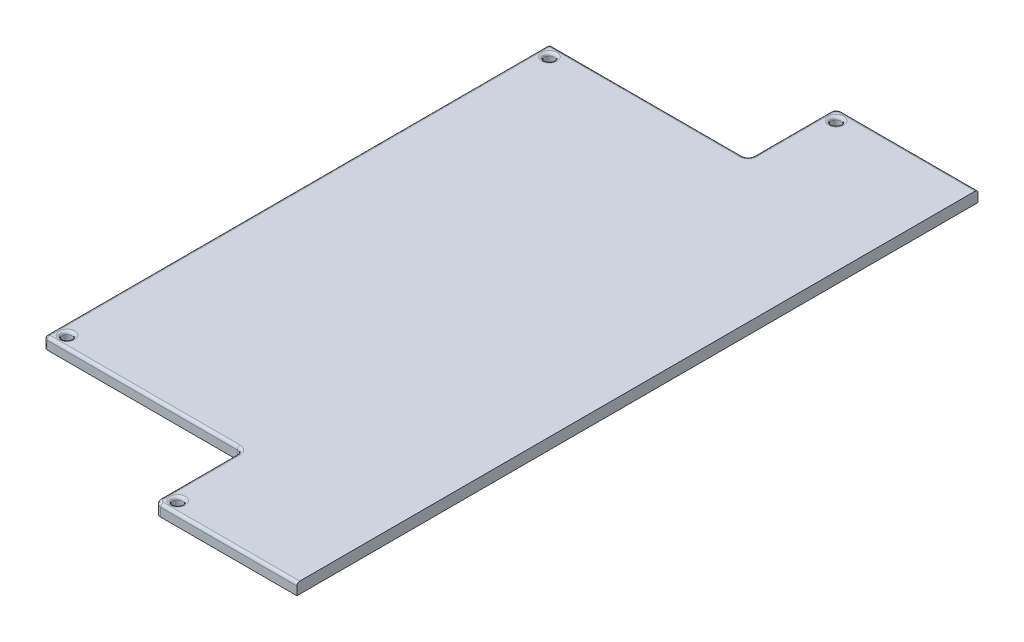
ISO-10303-21;
HEADER;
FILE_DESCRIPTION(('STEP AP214'),'2;1');
FILE_NAME('part.step','',(''),(''),'','','');
FILE_SCHEMA(('AUTOMOTIVE_DESIGN { 1 0 10303 214 1 1 1 1 }'));
ENDSEC;
DATA;
#1=APPLICATION_CONTEXT('core data for automotive mechanical design processes');
#2=APPLICATION_PROTOCOL_DEFINITION('international standard','automotive_design',2000,#1);
#3=PRODUCT_CONTEXT('',#1,'mechanical');
#4=PRODUCT('Part','Part','',(#3));
#5=PRODUCT_RELATED_PRODUCT_CATEGORY('part','',(#4));
#6=PRODUCT_DEFINITION_FORMATION('','',#4);
#7=PRODUCT_DEFINITION_CONTEXT('part definition',#1,'design');
#8=PRODUCT_DEFINITION('design','',#6,#7);
#9=PRODUCT_DEFINITION_SHAPE('','',#8);
#10=(LENGTH_UNIT() NAMED_UNIT(*) SI_UNIT(.MILLI.,.METRE.));
#11=(NAMED_UNIT(*) PLANE_ANGLE_UNIT() SI_UNIT($,.RADIAN.));
#12=(NAMED_UNIT(*) SI_UNIT($,.STERADIAN.) SOLID_ANGLE_UNIT());
#13=UNCERTAINTY_MEASURE_WITH_UNIT(LENGTH_MEASURE(1.E-05),#10,'distance_accuracy_value','');
#14=(GEOMETRIC_REPRESENTATION_CONTEXT(3) GLOBAL_UNCERTAINTY_ASSIGNED_CONTEXT((#13)) GLOBAL_UNIT_ASSIGNED_CONTEXT((#10,
#11,#12)) REPRESENTATION_CONTEXT('',''));
#15=CARTESIAN_POINT('',(0.,0.,0.));
#16=DIRECTION('',(0.,0.,1.));
#17=DIRECTION('',(1.,0.,0.));
#18=AXIS2_PLACEMENT_3D('',#15,#16,#17);
#19=CARTESIAN_POINT('',(0.,3.99999999999999,0.));
#20=DIRECTION('',(0.,-1.,0.));
#21=DIRECTION('',(0.,0.,-1.));
#22=AXIS2_PLACEMENT_3D('',#19,#20,#21);
#23=PLANE('',#22);
#24=CARTESIAN_POINT('',(-46.,3.99999999999999,116.));
#25=DIRECTION('',(0.,-1.,0.));
#26=DIRECTION('',(0.,0.,-1.));
#27=AXIS2_PLACEMENT_3D('',#24,#25,#26);
#28=CIRCLE('',#27,2.7);
#29=CARTESIAN_POINT('',(-46.,3.99999999999999,113.3));
#30=VERTEX_POINT('',#29);
#31=EDGE_CURVE('E286',#30,#30,#28,.T.);
#32=ORIENTED_EDGE('',*,*,#31,.T.);
#33=EDGE_LOOP('',(#32));
#34=FACE_BOUND('',#33,.T.);
#35=CARTESIAN_POINT('',(-116.,3.99999999999999,85.));
#36=DIRECTION('',(0.,-1.,0.));
#37=DIRECTION('',(0.,0.,-1.));
#38=AXIS2_PLACEMENT_3D('',#35,#36,#37);
#39=CIRCLE('',#38,2.7);
#40=CARTESIAN_POINT('',(-116.,3.99999999999999,82.3));
#41=VERTEX_POINT('',#40);
#42=EDGE_CURVE('E283',#41,#41,#39,.T.);
#43=ORIENTED_EDGE('',*,*,#42,.T.);
#44=EDGE_LOOP('',(#43));
#45=FACE_BOUND('',#44,.T.);
#46=CARTESIAN_POINT('',(-116.,3.99999999999999,-85.));
#47=DIRECTION('',(0.,-1.,0.));
#48=DIRECTION('',(0.,0.,-1.));
#49=AXIS2_PLACEMENT_3D('',#46,#47,#48);
#50=CIRCLE('',#49,2.7);
#51=CARTESIAN_POINT('',(-116.,3.99999999999999,-87.7));
#52=VERTEX_POINT('',#51);
#53=EDGE_CURVE('E280',#52,#52,#50,.T.);
#54=ORIENTED_EDGE('',*,*,#53,.T.);
#55=EDGE_LOOP('',(#54));
#56=FACE_BOUND('',#55,.T.);
#57=CARTESIAN_POINT('',(-46.,3.99999999999999,-116.));
#58=DIRECTION('',(0.,-1.,0.));
#59=DIRECTION('',(0.,0.,-1.));
#60=AXIS2_PLACEMENT_3D('',#57,#58,#59);
#61=CIRCLE('',#60,2.7);
#62=CARTESIAN_POINT('',(-46.,3.99999999999999,-118.7));
#63=VERTEX_POINT('',#62);
#64=EDGE_CURVE('E277',#63,#63,#61,.T.);
#65=ORIENTED_EDGE('',*,*,#64,.T.);
#66=EDGE_LOOP('',(#65));
#67=FACE_BOUND('',#66,.T.);
#68=CARTESIAN_POINT('',(-48.,3.99999999999999,118.));
#69=DIRECTION('',(0.,-1.,0.));
#70=DIRECTION('',(0.,0.,-1.));
#71=AXIS2_PLACEMENT_3D('',#68,#69,#70);
#72=CIRCLE('',#71,1.);
#73=CARTESIAN_POINT('',(-49.,3.99999999999999,118.));
#74=VERTEX_POINT('',#73);
#75=CARTESIAN_POINT('',(-48.,3.99999999999999,119.));
#76=VERTEX_POINT('',#75);
#77=EDGE_CURVE('E272',#74,#76,#72,.F.);
#78=ORIENTED_EDGE('',*,*,#77,.T.);
#79=DIRECTION('',(1.,0.,0.));
#80=VECTOR('',#79,1.);
#81=CARTESIAN_POINT('',(0.,3.99999999999999,119.));
#82=LINE('',#81,#80);
#83=CARTESIAN_POINT('',(0.,3.99999999999999,119.));
#84=VERTEX_POINT('',#83);
#85=EDGE_CURVE('E274',#76,#84,#82,.T.);
#86=ORIENTED_EDGE('',*,*,#85,.T.);
#87=DIRECTION('',(0.,0.,-1.));
#88=VECTOR('',#87,1.);
#89=CARTESIAN_POINT('',(0.,3.99999999999999,0.));
#90=LINE('',#89,#88);
#91=CARTESIAN_POINT('',(0.,3.99999999999999,-119.));
#92=VERTEX_POINT('',#91);
#93=EDGE_CURVE('E226',#84,#92,#90,.T.);
#94=ORIENTED_EDGE('',*,*,#93,.T.);
#95=DIRECTION('',(-1.,0.,0.));
#96=VECTOR('',#95,1.);
#97=CARTESIAN_POINT('',(0.,3.99999999999999,-119.));
#98=LINE('',#97,#96);
#99=CARTESIAN_POINT('',(-48.,3.99999999999999,-119.));
#100=VERTEX_POINT('',#99);
#101=EDGE_CURVE('E266',#92,#100,#98,.T.);
#102=ORIENTED_EDGE('',*,*,#101,.T.);
#103=CARTESIAN_POINT('',(-48.,3.99999999999999,-118.));
#104=DIRECTION('',(0.,-1.,0.));
#105=DIRECTION('',(0.,0.,-1.));
#106=AXIS2_PLACEMENT_3D('',#103,#104,#105);
#107=CIRCLE('',#106,1.);
#108=CARTESIAN_POINT('',(-49.,3.99999999999999,-118.));
#109=VERTEX_POINT('',#108);
#110=EDGE_CURVE('E264',#100,#109,#107,.F.);
#111=ORIENTED_EDGE('',*,*,#110,.T.);
#112=DIRECTION('',(0.,0.,1.));
#113=VECTOR('',#112,1.);
#114=CARTESIAN_POINT('',(-49.,3.99999999999999,0.));
#115=LINE('',#114,#113);
#116=CARTESIAN_POINT('',(-49.,3.99999999999999,-91.));
#117=VERTEX_POINT('',#116);
#118=EDGE_CURVE('E262',#109,#117,#115,.T.);
#119=ORIENTED_EDGE('',*,*,#118,.T.);
#120=CARTESIAN_POINT('',(-52.,3.99999999999999,-91.));
#121=DIRECTION('',(0.,-1.,0.));
#122=DIRECTION('',(0.,0.,-1.));
#123=AXIS2_PLACEMENT_3D('',#120,#121,#122);
#124=CIRCLE('',#123,3.);
#125=CARTESIAN_POINT('',(-52.,3.99999999999999,-88.));
#126=VERTEX_POINT('',#125);
#127=EDGE_CURVE('E260',#117,#126,#124,.T.);
#128=ORIENTED_EDGE('',*,*,#127,.T.);
#129=DIRECTION('',(-1.,0.,0.));
#130=VECTOR('',#129,1.);
#131=CARTESIAN_POINT('',(0.,3.99999999999999,-88.));
#132=LINE('',#131,#130);
#133=CARTESIAN_POINT('',(-119.,3.99999999999999,-88.));
#134=VERTEX_POINT('',#133);
#135=EDGE_CURVE('E256',#126,#134,#132,.T.);
#136=ORIENTED_EDGE('',*,*,#135,.T.);
#137=DIRECTION('',(0.,0.,1.));
#138=VECTOR('',#137,1.);
#139=CARTESIAN_POINT('',(-119.,3.99999999999999,0.));
#140=LINE('',#139,#138);
#141=CARTESIAN_POINT('',(-119.,3.99999999999999,88.));
#142=VERTEX_POINT('',#141);
#143=EDGE_CURVE('E254',#134,#142,#140,.T.);
#144=ORIENTED_EDGE('',*,*,#143,.T.);
#145=DIRECTION('',(1.,0.,0.));
#146=VECTOR('',#145,1.);
#147=CARTESIAN_POINT('',(0.,3.99999999999999,88.));
#148=LINE('',#147,#146);
#149=CARTESIAN_POINT('',(-52.,3.99999999999999,88.));
#150=VERTEX_POINT('',#149);
#151=EDGE_CURVE('E258',#142,#150,#148,.T.);
#152=ORIENTED_EDGE('',*,*,#151,.T.);
#153=CARTESIAN_POINT('',(-52.,3.99999999999999,91.));
#154=DIRECTION('',(0.,-1.,0.));
#155=DIRECTION('',(0.,0.,-1.));
#156=AXIS2_PLACEMENT_3D('',#153,#154,#155);
#157=CIRCLE('',#156,3.);
#158=CARTESIAN_POINT('',(-49.,3.99999999999999,91.));
#159=VERTEX_POINT('',#158);
#160=EDGE_CURVE('E268',#150,#159,#157,.T.);
#161=ORIENTED_EDGE('',*,*,#160,.T.);
#162=DIRECTION('',(0.,0.,1.));
#163=VECTOR('',#162,1.);
#164=CARTESIAN_POINT('',(-49.,3.99999999999999,0.));
#165=LINE('',#164,#163);
#166=EDGE_CURVE('E270',#159,#74,#165,.T.);
#167=ORIENTED_EDGE('',*,*,#166,.T.);
#168=EDGE_LOOP('',(#78,#86,#94,#102,#111,#119,#128,#136,#144,#152,#161,#167));
#169=FACE_BOUND('',#168,.T.);
#170=ADVANCED_FACE('F41',(#34,#45,#56,#67,#169),#23,.F.);
#171=CARTESIAN_POINT('',(0.,0.,0.));
#172=DIRECTION('',(0.,-1.,0.));
#173=DIRECTION('',(0.,0.,-1.));
#174=AXIS2_PLACEMENT_3D('',#171,#172,#173);
#175=PLANE('',#174);
#176=CARTESIAN_POINT('',(-116.,0.,-85.));
#177=DIRECTION('',(0.,1.,0.));
#178=DIRECTION('',(0.,0.,1.));
#179=AXIS2_PLACEMENT_3D('',#176,#177,#178);
#180=CIRCLE('',#179,1.7);
#181=CARTESIAN_POINT('',(-116.,0.,-83.3));
#182=VERTEX_POINT('',#181);
#183=EDGE_CURVE('E381',#182,#182,#180,.T.);
#184=ORIENTED_EDGE('',*,*,#183,.T.);
#185=EDGE_LOOP('',(#184));
#186=FACE_BOUND('',#185,.T.);
#187=CARTESIAN_POINT('',(-46.,0.,116.));
#188=DIRECTION('',(0.,1.,0.));
#189=DIRECTION('',(0.,0.,1.));
#190=AXIS2_PLACEMENT_3D('',#187,#188,#189);
#191=CIRCLE('',#190,1.7);
#192=CARTESIAN_POINT('',(-46.,0.,117.7));
#193=VERTEX_POINT('',#192);
#194=EDGE_CURVE('E200',#193,#193,#191,.T.);
#195=ORIENTED_EDGE('',*,*,#194,.T.);
#196=EDGE_LOOP('',(#195));
#197=FACE_BOUND('',#196,.T.);
#198=DIRECTION('',(1.,0.,0.));
#199=VECTOR('',#198,1.);
#200=CARTESIAN_POINT('',(-50.,0.,89.));
#201=LINE('',#200,#199);
#202=CARTESIAN_POINT('',(-119.,0.,89.));
#203=VERTEX_POINT('',#202);
#204=CARTESIAN_POINT('',(-52.,0.,89.));
#205=VERTEX_POINT('',#204);
#206=EDGE_CURVE('E219',#203,#205,#201,.T.);
#207=ORIENTED_EDGE('',*,*,#206,.F.);
#208=CARTESIAN_POINT('',(-119.,0.,88.));
#209=DIRECTION('',(0.,-1.,0.));
#210=DIRECTION('',(0.,0.,-1.));
#211=AXIS2_PLACEMENT_3D('',#208,#209,#210);
#212=CIRCLE('',#211,1.);
#213=CARTESIAN_POINT('',(-120.,0.,88.));
#214=VERTEX_POINT('',#213);
#215=EDGE_CURVE('E11',#203,#214,#212,.T.);
#216=ORIENTED_EDGE('',*,*,#215,.T.);
#217=DIRECTION('',(0.,0.,1.));
#218=VECTOR('',#217,1.);
#219=CARTESIAN_POINT('',(-120.,0.,89.));
#220=LINE('',#219,#218);
#221=CARTESIAN_POINT('',(-120.,0.,-88.));
#222=VERTEX_POINT('',#221);
#223=EDGE_CURVE('E217',#222,#214,#220,.T.);
#224=ORIENTED_EDGE('',*,*,#223,.F.);
#225=CARTESIAN_POINT('',(-119.,0.,-88.));
#226=DIRECTION('',(0.,-1.,0.));
#227=DIRECTION('',(0.,0.,-1.));
#228=AXIS2_PLACEMENT_3D('',#225,#226,#227);
#229=CIRCLE('',#228,1.);
#230=CARTESIAN_POINT('',(-119.,0.,-89.));
#231=VERTEX_POINT('',#230);
#232=EDGE_CURVE('E50',#222,#231,#229,.T.);
#233=ORIENTED_EDGE('',*,*,#232,.T.);
#234=DIRECTION('',(-1.,0.,0.));
#235=VECTOR('',#234,1.);
#236=CARTESIAN_POINT('',(-50.,0.,-89.));
#237=LINE('',#236,#235);
#238=CARTESIAN_POINT('',(-52.,0.,-89.));
#239=VERTEX_POINT('',#238);
#240=EDGE_CURVE('E211',#239,#231,#237,.T.);
#241=ORIENTED_EDGE('',*,*,#240,.F.);
#242=CARTESIAN_POINT('',(-52.,0.,-91.));
#243=DIRECTION('',(0.,-1.,0.));
#244=DIRECTION('',(0.,0.,-1.));
#245=AXIS2_PLACEMENT_3D('',#242,#243,#244);
#246=CIRCLE('',#245,2.);
#247=CARTESIAN_POINT('',(-50.,0.,-91.));
#248=VERTEX_POINT('',#247);
#249=EDGE_CURVE('E249',#239,#248,#246,.F.);
#250=ORIENTED_EDGE('',*,*,#249,.T.);
#251=DIRECTION('',(0.,0.,1.));
#252=VECTOR('',#251,1.);
#253=CARTESIAN_POINT('',(-50.,0.,-120.));
#254=LINE('',#253,#252);
#255=CARTESIAN_POINT('',(-50.,0.,-118.));
#256=VERTEX_POINT('',#255);
#257=EDGE_CURVE('E208',#256,#248,#254,.T.);
#258=ORIENTED_EDGE('',*,*,#257,.F.);
#259=CARTESIAN_POINT('',(-48.,0.,-118.));
#260=DIRECTION('',(0.,-1.,0.));
#261=DIRECTION('',(0.,0.,-1.));
#262=AXIS2_PLACEMENT_3D('',#259,#260,#261);
#263=CIRCLE('',#262,2.);
#264=CARTESIAN_POINT('',(-48.,0.,-120.));
#265=VERTEX_POINT('',#264);
#266=EDGE_CURVE('E207',#256,#265,#263,.T.);
#267=ORIENTED_EDGE('',*,*,#266,.T.);
#268=DIRECTION('',(-1.,0.,0.));
#269=VECTOR('',#268,1.);
#270=CARTESIAN_POINT('',(-50.,0.,-120.));
#271=LINE('',#270,#269);
#272=CARTESIAN_POINT('',(0.,0.,-120.));
#273=VERTEX_POINT('',#272);
#274=EDGE_CURVE('E183',#273,#265,#271,.T.);
#275=ORIENTED_EDGE('',*,*,#274,.F.);
#276=DIRECTION('',(0.,0.,-1.));
#277=VECTOR('',#276,1.);
#278=CARTESIAN_POINT('',(0.,0.,0.));
#279=LINE('',#278,#277);
#280=CARTESIAN_POINT('',(0.,0.,120.));
#281=VERTEX_POINT('',#280);
#282=EDGE_CURVE('E193',#281,#273,#279,.T.);
#283=ORIENTED_EDGE('',*,*,#282,.F.);
#284=DIRECTION('',(1.,0.,0.));
#285=VECTOR('',#284,1.);
#286=CARTESIAN_POINT('',(0.,0.,120.));
#287=LINE('',#286,#285);
#288=CARTESIAN_POINT('',(-48.,0.,120.));
#289=VERTEX_POINT('',#288);
#290=EDGE_CURVE('E224',#289,#281,#287,.T.);
#291=ORIENTED_EDGE('',*,*,#290,.F.);
#292=CARTESIAN_POINT('',(-48.,0.,118.));
#293=DIRECTION('',(0.,-1.,0.));
#294=DIRECTION('',(0.,0.,-1.));
#295=AXIS2_PLACEMENT_3D('',#292,#293,#294);
#296=CIRCLE('',#295,2.);
#297=CARTESIAN_POINT('',(-50.,0.,118.));
#298=VERTEX_POINT('',#297);
#299=EDGE_CURVE('E234',#289,#298,#296,.T.);
#300=ORIENTED_EDGE('',*,*,#299,.T.);
#301=DIRECTION('',(0.,0.,1.));
#302=VECTOR('',#301,1.);
#303=CARTESIAN_POINT('',(-50.,0.,120.));
#304=LINE('',#303,#302);
#305=CARTESIAN_POINT('',(-50.,0.,91.));
#306=VERTEX_POINT('',#305);
#307=EDGE_CURVE('E221',#306,#298,#304,.T.);
#308=ORIENTED_EDGE('',*,*,#307,.F.);
#309=CARTESIAN_POINT('',(-52.,0.,91.));
#310=DIRECTION('',(0.,-1.,0.));
#311=DIRECTION('',(0.,0.,-1.));
#312=AXIS2_PLACEMENT_3D('',#309,#310,#311);
#313=CIRCLE('',#312,2.);
#314=EDGE_CURVE('E251',#306,#205,#313,.F.);
#315=ORIENTED_EDGE('',*,*,#314,.T.);
#316=EDGE_LOOP('',(#207,#216,#224,#233,#241,#250,#258,#267,#275,#283,#291,#300,#308,#315));
#317=FACE_BOUND('',#316,.T.);
#318=CARTESIAN_POINT('',(-116.,0.,85.));
#319=DIRECTION('',(0.,1.,0.));
#320=DIRECTION('',(0.,0.,1.));
#321=AXIS2_PLACEMENT_3D('',#318,#319,#320);
#322=CIRCLE('',#321,1.7);
#323=CARTESIAN_POINT('',(-116.,0.,86.7));
#324=VERTEX_POINT('',#323);
#325=EDGE_CURVE('E386',#324,#324,#322,.T.);
#326=ORIENTED_EDGE('',*,*,#325,.T.);
#327=EDGE_LOOP('',(#326));
#328=FACE_BOUND('',#327,.T.);
#329=CARTESIAN_POINT('',(-46.,0.,-116.));
#330=DIRECTION('',(0.,1.,0.));
#331=DIRECTION('',(0.,0.,1.));
#332=AXIS2_PLACEMENT_3D('',#329,#330,#331);
#333=CIRCLE('',#332,1.7);
#334=CARTESIAN_POINT('',(-46.,0.,-114.3));
#335=VERTEX_POINT('',#334);
#336=EDGE_CURVE('E375',#335,#335,#333,.T.);
#337=ORIENTED_EDGE('',*,*,#336,.T.);
#338=EDGE_LOOP('',(#337));
#339=FACE_BOUND('',#338,.T.);
#340=ADVANCED_FACE('F203',(#186,#197,#317,#328,#339),#175,.T.);
#341=CARTESIAN_POINT('',(0.,3.99999999999999,0.));
#342=DIRECTION('',(-1.,0.,0.));
#343=DIRECTION('',(0.,0.,1.));
#344=AXIS2_PLACEMENT_3D('',#341,#342,#343);
#345=PLANE('',#344);
#346=ORIENTED_EDGE('',*,*,#93,.F.);
#347=CARTESIAN_POINT('',(0.,2.99999999999999,119.));
#348=DIRECTION('',(-1.,0.,0.));
#349=DIRECTION('',(0.,0.,1.));
#350=AXIS2_PLACEMENT_3D('',#347,#348,#349);
#351=CIRCLE('',#350,1.);
#352=CARTESIAN_POINT('',(0.,2.99999999999999,120.));
#353=VERTEX_POINT('',#352);
#354=EDGE_CURVE('E291',#84,#353,#351,.F.);
#355=ORIENTED_EDGE('',*,*,#354,.T.);
#356=DIRECTION('',(0.,-1.,0.));
#357=VECTOR('',#356,1.);
#358=CARTESIAN_POINT('',(0.,3.99999999999999,120.));
#359=LINE('',#358,#357);
#360=EDGE_CURVE('E190',#353,#281,#359,.T.);
#361=ORIENTED_EDGE('',*,*,#360,.T.);
#362=ORIENTED_EDGE('',*,*,#282,.T.);
#363=DIRECTION('',(0.,-1.,0.));
#364=VECTOR('',#363,1.);
#365=CARTESIAN_POINT('',(0.,3.99999999999999,-120.));
#366=LINE('',#365,#364);
#367=CARTESIAN_POINT('',(0.,2.99999999999999,-120.));
#368=VERTEX_POINT('',#367);
#369=EDGE_CURVE('E178',#368,#273,#366,.T.);
#370=ORIENTED_EDGE('',*,*,#369,.F.);
#371=CARTESIAN_POINT('',(0.,2.99999999999999,-119.));
#372=DIRECTION('',(-1.,0.,0.));
#373=DIRECTION('',(0.,0.,1.));
#374=AXIS2_PLACEMENT_3D('',#371,#372,#373);
#375=CIRCLE('',#374,1.);
#376=EDGE_CURVE('E289',#368,#92,#375,.F.);
#377=ORIENTED_EDGE('',*,*,#376,.T.);
#378=EDGE_LOOP('',(#346,#355,#361,#362,#370,#377));
#379=FACE_BOUND('',#378,.T.);
#380=ADVANCED_FACE('F195',(#379),#345,.F.);
#381=CARTESIAN_POINT('',(-50.,3.99999999999999,-120.));
#382=DIRECTION('',(0.,0.,1.));
#383=DIRECTION('',(1.,0.,0.));
#384=AXIS2_PLACEMENT_3D('',#381,#382,#383);
#385=PLANE('',#384);
#386=DIRECTION('',(0.,-1.,0.));
#387=VECTOR('',#386,1.);
#388=CARTESIAN_POINT('',(-48.,3.99999999999999,-120.));
#389=LINE('',#388,#387);
#390=CARTESIAN_POINT('',(-48.,2.99999999999999,-120.));
#391=VERTEX_POINT('',#390);
#392=EDGE_CURVE('E237',#265,#391,#389,.F.);
#393=ORIENTED_EDGE('',*,*,#392,.T.);
#394=DIRECTION('',(-1.,0.,0.));
#395=VECTOR('',#394,1.);
#396=CARTESIAN_POINT('',(-50.,2.99999999999999,-120.));
#397=LINE('',#396,#395);
#398=EDGE_CURVE('E186',#391,#368,#397,.F.);
#399=ORIENTED_EDGE('',*,*,#398,.T.);
#400=ORIENTED_EDGE('',*,*,#369,.T.);
#401=ORIENTED_EDGE('',*,*,#274,.T.);
#402=EDGE_LOOP('',(#393,#399,#400,#401));
#403=FACE_BOUND('',#402,.T.);
#404=ADVANCED_FACE('F181',(#403),#385,.F.);
#405=CARTESIAN_POINT('',(-50.,3.99999999999999,-120.));
#406=DIRECTION('',(1.,0.,0.));
#407=DIRECTION('',(0.,0.,-1.));
#408=AXIS2_PLACEMENT_3D('',#405,#406,#407);
#409=PLANE('',#408);
#410=DIRECTION('',(0.,-1.,0.));
#411=VECTOR('',#410,1.);
#412=CARTESIAN_POINT('',(-50.,3.99999999999999,-91.));
#413=LINE('',#412,#411);
#414=CARTESIAN_POINT('',(-50.,2.99999999999999,-91.));
#415=VERTEX_POINT('',#414);
#416=EDGE_CURVE('E231',#248,#415,#413,.F.);
#417=ORIENTED_EDGE('',*,*,#416,.T.);
#418=DIRECTION('',(0.,0.,1.));
#419=VECTOR('',#418,1.);
#420=CARTESIAN_POINT('',(-50.,2.99999999999999,-120.));
#421=LINE('',#420,#419);
#422=CARTESIAN_POINT('',(-50.,2.99999999999999,-118.));
#423=VERTEX_POINT('',#422);
#424=EDGE_CURVE('E304',#415,#423,#421,.F.);
#425=ORIENTED_EDGE('',*,*,#424,.T.);
#426=DIRECTION('',(0.,-1.,0.));
#427=VECTOR('',#426,1.);
#428=CARTESIAN_POINT('',(-50.,3.99999999999999,-118.));
#429=LINE('',#428,#427);
#430=EDGE_CURVE('E229',#423,#256,#429,.T.);
#431=ORIENTED_EDGE('',*,*,#430,.T.);
#432=ORIENTED_EDGE('',*,*,#257,.T.);
#433=EDGE_LOOP('',(#417,#425,#431,#432));
#434=FACE_BOUND('',#433,.T.);
#435=ADVANCED_FACE('F495',(#434),#409,.F.);
#436=CARTESIAN_POINT('',(-50.,3.99999999999999,-89.));
#437=DIRECTION('',(0.,0.,1.));
#438=DIRECTION('',(1.,0.,0.));
#439=AXIS2_PLACEMENT_3D('',#436,#437,#438);
#440=PLANE('',#439);
#441=DIRECTION('',(0.,-1.,0.));
#442=VECTOR('',#441,1.);
#443=CARTESIAN_POINT('',(-119.,3.99999999999999,-89.));
#444=LINE('',#443,#442);
#445=CARTESIAN_POINT('',(-119.,2.99999999999999,-89.));
#446=VERTEX_POINT('',#445);
#447=EDGE_CURVE('E324',#231,#446,#444,.F.);
#448=ORIENTED_EDGE('',*,*,#447,.T.);
#449=DIRECTION('',(-1.,0.,0.));
#450=VECTOR('',#449,1.);
#451=CARTESIAN_POINT('',(-50.,2.99999999999999,-89.));
#452=LINE('',#451,#450);
#453=CARTESIAN_POINT('',(-52.,2.99999999999999,-89.));
#454=VERTEX_POINT('',#453);
#455=EDGE_CURVE('E326',#446,#454,#452,.F.);
#456=ORIENTED_EDGE('',*,*,#455,.T.);
#457=DIRECTION('',(0.,-1.,0.));
#458=VECTOR('',#457,1.);
#459=CARTESIAN_POINT('',(-52.,0.,-89.));
#460=LINE('',#459,#458);
#461=EDGE_CURVE('E189',#454,#239,#460,.T.);
#462=ORIENTED_EDGE('',*,*,#461,.T.);
#463=ORIENTED_EDGE('',*,*,#240,.T.);
#464=EDGE_LOOP('',(#448,#456,#462,#463));
#465=FACE_BOUND('',#464,.T.);
#466=ADVANCED_FACE('F492',(#465),#440,.F.);
#467=CARTESIAN_POINT('',(-120.,3.99999999999999,89.));
#468=DIRECTION('',(1.,0.,0.));
#469=DIRECTION('',(0.,0.,-1.));
#470=AXIS2_PLACEMENT_3D('',#467,#468,#469);
#471=PLANE('',#470);
#472=ORIENTED_EDGE('',*,*,#223,.T.);
#473=DIRECTION('',(0.,-1.,0.));
#474=VECTOR('',#473,1.);
#475=CARTESIAN_POINT('',(-120.,3.99999999999999,88.));
#476=LINE('',#475,#474);
#477=CARTESIAN_POINT('',(-120.,2.99999999999999,88.));
#478=VERTEX_POINT('',#477);
#479=EDGE_CURVE('E58',#214,#478,#476,.F.);
#480=ORIENTED_EDGE('',*,*,#479,.T.);
#481=DIRECTION('',(0.,0.,1.));
#482=VECTOR('',#481,1.);
#483=CARTESIAN_POINT('',(-120.,2.99999999999999,89.));
#484=LINE('',#483,#482);
#485=CARTESIAN_POINT('',(-120.,2.99999999999999,-88.));
#486=VERTEX_POINT('',#485);
#487=EDGE_CURVE('E62',#478,#486,#484,.F.);
#488=ORIENTED_EDGE('',*,*,#487,.T.);
#489=DIRECTION('',(0.,-1.,0.));
#490=VECTOR('',#489,1.);
#491=CARTESIAN_POINT('',(-120.,3.99999999999999,-88.));
#492=LINE('',#491,#490);
#493=EDGE_CURVE('E328',#486,#222,#492,.T.);
#494=ORIENTED_EDGE('',*,*,#493,.T.);
#495=EDGE_LOOP('',(#472,#480,#488,#494));
#496=FACE_BOUND('',#495,.T.);
#497=ADVANCED_FACE('F488',(#496),#471,.F.);
#498=CARTESIAN_POINT('',(-50.,3.99999999999999,89.));
#499=DIRECTION('',(0.,0.,-1.));
#500=DIRECTION('',(-1.,0.,0.));
#501=AXIS2_PLACEMENT_3D('',#498,#499,#500);
#502=PLANE('',#501);
#503=DIRECTION('',(0.,-1.,0.));
#504=VECTOR('',#503,1.);
#505=CARTESIAN_POINT('',(-52.,3.99999999999999,89.));
#506=LINE('',#505,#504);
#507=CARTESIAN_POINT('',(-52.,2.99999999999999,89.));
#508=VERTEX_POINT('',#507);
#509=EDGE_CURVE('E246',#205,#508,#506,.F.);
#510=ORIENTED_EDGE('',*,*,#509,.T.);
#511=DIRECTION('',(1.,0.,0.));
#512=VECTOR('',#511,1.);
#513=CARTESIAN_POINT('',(-50.,2.99999999999999,89.));
#514=LINE('',#513,#512);
#515=CARTESIAN_POINT('',(-119.,2.99999999999999,89.));
#516=VERTEX_POINT('',#515);
#517=EDGE_CURVE('E322',#508,#516,#514,.F.);
#518=ORIENTED_EDGE('',*,*,#517,.T.);
#519=DIRECTION('',(0.,-1.,0.));
#520=VECTOR('',#519,1.);
#521=CARTESIAN_POINT('',(-119.,3.99999999999999,89.));
#522=LINE('',#521,#520);
#523=EDGE_CURVE('E320',#516,#203,#522,.T.);
#524=ORIENTED_EDGE('',*,*,#523,.T.);
#525=ORIENTED_EDGE('',*,*,#206,.T.);
#526=EDGE_LOOP('',(#510,#518,#524,#525));
#527=FACE_BOUND('',#526,.T.);
#528=ADVANCED_FACE('F485',(#527),#502,.F.);
#529=CARTESIAN_POINT('',(-50.,3.99999999999999,120.));
#530=DIRECTION('',(1.,0.,0.));
#531=DIRECTION('',(0.,0.,-1.));
#532=AXIS2_PLACEMENT_3D('',#529,#530,#531);
#533=PLANE('',#532);
#534=DIRECTION('',(0.,-1.,0.));
#535=VECTOR('',#534,1.);
#536=CARTESIAN_POINT('',(-50.,3.99999999999999,118.));
#537=LINE('',#536,#535);
#538=CARTESIAN_POINT('',(-50.,2.99999999999999,118.));
#539=VERTEX_POINT('',#538);
#540=EDGE_CURVE('E243',#298,#539,#537,.F.);
#541=ORIENTED_EDGE('',*,*,#540,.T.);
#542=DIRECTION('',(0.,0.,1.));
#543=VECTOR('',#542,1.);
#544=CARTESIAN_POINT('',(-50.,2.99999999999999,120.));
#545=LINE('',#544,#543);
#546=CARTESIAN_POINT('',(-50.,2.99999999999999,91.));
#547=VERTEX_POINT('',#546);
#548=EDGE_CURVE('E297',#539,#547,#545,.F.);
#549=ORIENTED_EDGE('',*,*,#548,.T.);
#550=DIRECTION('',(0.,-1.,0.));
#551=VECTOR('',#550,1.);
#552=CARTESIAN_POINT('',(-50.,0.,91.));
#553=LINE('',#552,#551);
#554=EDGE_CURVE('E241',#547,#306,#553,.T.);
#555=ORIENTED_EDGE('',*,*,#554,.T.);
#556=ORIENTED_EDGE('',*,*,#307,.T.);
#557=EDGE_LOOP('',(#541,#549,#555,#556));
#558=FACE_BOUND('',#557,.T.);
#559=ADVANCED_FACE('F451',(#558),#533,.F.);
#560=CARTESIAN_POINT('',(0.,3.99999999999999,120.));
#561=DIRECTION('',(0.,0.,-1.));
#562=DIRECTION('',(-1.,0.,0.));
#563=AXIS2_PLACEMENT_3D('',#560,#561,#562);
#564=PLANE('',#563);
#565=ORIENTED_EDGE('',*,*,#360,.F.);
#566=DIRECTION('',(1.,0.,0.));
#567=VECTOR('',#566,1.);
#568=CARTESIAN_POINT('',(0.,2.99999999999999,120.));
#569=LINE('',#568,#567);
#570=CARTESIAN_POINT('',(-48.,2.99999999999999,120.));
#571=VERTEX_POINT('',#570);
#572=EDGE_CURVE('E293',#353,#571,#569,.F.);
#573=ORIENTED_EDGE('',*,*,#572,.T.);
#574=DIRECTION('',(0.,-1.,0.));
#575=VECTOR('',#574,1.);
#576=CARTESIAN_POINT('',(-48.,3.99999999999999,120.));
#577=LINE('',#576,#575);
#578=EDGE_CURVE('E239',#571,#289,#577,.T.);
#579=ORIENTED_EDGE('',*,*,#578,.T.);
#580=ORIENTED_EDGE('',*,*,#290,.T.);
#581=EDGE_LOOP('',(#565,#573,#579,#580));
#582=FACE_BOUND('',#581,.T.);
#583=ADVANCED_FACE('F444',(#582),#564,.F.);
#584=CARTESIAN_POINT('',(-46.,3.99999999999999,116.));
#585=DIRECTION('',(0.,-1.,0.));
#586=DIRECTION('',(0.,0.,-1.));
#587=AXIS2_PLACEMENT_3D('',#584,#585,#586);
#588=CYLINDRICAL_SURFACE('',#587,1.7);
#589=CARTESIAN_POINT('',(-46.,2.99999999999999,116.));
#590=DIRECTION('',(0.,-1.,0.));
#591=DIRECTION('',(0.,0.,-1.));
#592=AXIS2_PLACEMENT_3D('',#589,#590,#591);
#593=CIRCLE('',#592,1.7);
#594=CARTESIAN_POINT('',(-46.,2.99999999999999,114.3));
#595=VERTEX_POINT('',#594);
#596=EDGE_CURVE('E308',#595,#595,#593,.F.);
#597=ORIENTED_EDGE('',*,*,#596,.T.);
#598=EDGE_LOOP('',(#597));
#599=FACE_BOUND('',#598,.T.);
#600=ORIENTED_EDGE('',*,*,#194,.F.);
#601=EDGE_LOOP('',(#600));
#602=FACE_BOUND('',#601,.T.);
#603=ADVANCED_FACE('F478',(#599,#602),#588,.F.);
#604=CARTESIAN_POINT('',(-116.,3.99999999999999,85.));
#605=DIRECTION('',(0.,-1.,0.));
#606=DIRECTION('',(0.,0.,-1.));
#607=AXIS2_PLACEMENT_3D('',#604,#605,#606);
#608=CYLINDRICAL_SURFACE('',#607,1.7);
#609=CARTESIAN_POINT('',(-116.,2.99999999999999,85.));
#610=DIRECTION('',(0.,-1.,0.));
#611=DIRECTION('',(0.,0.,-1.));
#612=AXIS2_PLACEMENT_3D('',#609,#610,#611);
#613=CIRCLE('',#612,1.7);
#614=CARTESIAN_POINT('',(-116.,2.99999999999999,83.3));
#615=VERTEX_POINT('',#614);
#616=EDGE_CURVE('E311',#615,#615,#613,.F.);
#617=ORIENTED_EDGE('',*,*,#616,.T.);
#618=EDGE_LOOP('',(#617));
#619=FACE_BOUND('',#618,.T.);
#620=ORIENTED_EDGE('',*,*,#325,.F.);
#621=EDGE_LOOP('',(#620));
#622=FACE_BOUND('',#621,.T.);
#623=ADVANCED_FACE('F566',(#619,#622),#608,.F.);
#624=CARTESIAN_POINT('',(-116.,3.99999999999999,-85.));
#625=DIRECTION('',(0.,-1.,0.));
#626=DIRECTION('',(0.,0.,-1.));
#627=AXIS2_PLACEMENT_3D('',#624,#625,#626);
#628=CYLINDRICAL_SURFACE('',#627,1.7);
#629=CARTESIAN_POINT('',(-116.,2.99999999999999,-85.));
#630=DIRECTION('',(0.,-1.,0.));
#631=DIRECTION('',(0.,0.,-1.));
#632=AXIS2_PLACEMENT_3D('',#629,#630,#631);
#633=CIRCLE('',#632,1.7);
#634=CARTESIAN_POINT('',(-116.,2.99999999999999,-86.7));
#635=VERTEX_POINT('',#634);
#636=EDGE_CURVE('E314',#635,#635,#633,.F.);
#637=ORIENTED_EDGE('',*,*,#636,.T.);
#638=EDGE_LOOP('',(#637));
#639=FACE_BOUND('',#638,.T.);
#640=ORIENTED_EDGE('',*,*,#183,.F.);
#641=EDGE_LOOP('',(#640));
#642=FACE_BOUND('',#641,.T.);
#643=ADVANCED_FACE('F510',(#639,#642),#628,.F.);
#644=CARTESIAN_POINT('',(-46.,3.99999999999999,-116.));
#645=DIRECTION('',(0.,-1.,0.));
#646=DIRECTION('',(0.,0.,-1.));
#647=AXIS2_PLACEMENT_3D('',#644,#645,#646);
#648=CYLINDRICAL_SURFACE('',#647,1.7);
#649=CARTESIAN_POINT('',(-46.,2.99999999999999,-116.));
#650=DIRECTION('',(0.,-1.,0.));
#651=DIRECTION('',(0.,0.,-1.));
#652=AXIS2_PLACEMENT_3D('',#649,#650,#651);
#653=CIRCLE('',#652,1.7);
#654=CARTESIAN_POINT('',(-46.,2.99999999999999,-117.7));
#655=VERTEX_POINT('',#654);
#656=EDGE_CURVE('E317',#655,#655,#653,.F.);
#657=ORIENTED_EDGE('',*,*,#656,.T.);
#658=EDGE_LOOP('',(#657));
#659=FACE_BOUND('',#658,.T.);
#660=ORIENTED_EDGE('',*,*,#336,.F.);
#661=EDGE_LOOP('',(#660));
#662=FACE_BOUND('',#661,.T.);
#663=ADVANCED_FACE('F505',(#659,#662),#648,.F.);
#664=CARTESIAN_POINT('',(-52.,3.99999999999999,-91.));
#665=DIRECTION('',(0.,1.,0.));
#666=DIRECTION('',(0.,0.,1.));
#667=AXIS2_PLACEMENT_3D('',#664,#665,#666);
#668=CYLINDRICAL_SURFACE('',#667,2.);
#669=ORIENTED_EDGE('',*,*,#461,.F.);
#670=CARTESIAN_POINT('',(-52.,2.99999999999999,-91.));
#671=DIRECTION('',(0.,-1.,0.));
#672=DIRECTION('',(0.,0.,-1.));
#673=AXIS2_PLACEMENT_3D('',#670,#671,#672);
#674=CIRCLE('',#673,2.);
#675=EDGE_CURVE('E306',#454,#415,#674,.F.);
#676=ORIENTED_EDGE('',*,*,#675,.T.);
#677=ORIENTED_EDGE('',*,*,#416,.F.);
#678=ORIENTED_EDGE('',*,*,#249,.F.);
#679=EDGE_LOOP('',(#669,#676,#677,#678));
#680=FACE_BOUND('',#679,.T.);
#681=ADVANCED_FACE('F465',(#680),#668,.F.);
#682=CARTESIAN_POINT('',(-48.,3.99999999999999,-118.));
#683=DIRECTION('',(0.,-1.,0.));
#684=DIRECTION('',(0.,0.,-1.));
#685=AXIS2_PLACEMENT_3D('',#682,#683,#684);
#686=CYLINDRICAL_SURFACE('',#685,2.);
#687=ORIENTED_EDGE('',*,*,#430,.F.);
#688=CARTESIAN_POINT('',(-48.,2.99999999999999,-118.));
#689=DIRECTION('',(0.,-1.,0.));
#690=DIRECTION('',(0.,0.,-1.));
#691=AXIS2_PLACEMENT_3D('',#688,#689,#690);
#692=CIRCLE('',#691,2.);
#693=EDGE_CURVE('E302',#423,#391,#692,.T.);
#694=ORIENTED_EDGE('',*,*,#693,.T.);
#695=ORIENTED_EDGE('',*,*,#392,.F.);
#696=ORIENTED_EDGE('',*,*,#266,.F.);
#697=EDGE_LOOP('',(#687,#694,#695,#696));
#698=FACE_BOUND('',#697,.T.);
#699=ADVANCED_FACE('F457',(#698),#686,.T.);
#700=CARTESIAN_POINT('',(-48.,3.99999999999999,118.));
#701=DIRECTION('',(0.,-1.,0.));
#702=DIRECTION('',(0.,0.,-1.));
#703=AXIS2_PLACEMENT_3D('',#700,#701,#702);
#704=CYLINDRICAL_SURFACE('',#703,2.);
#705=ORIENTED_EDGE('',*,*,#578,.F.);
#706=CARTESIAN_POINT('',(-48.,2.99999999999999,118.));
#707=DIRECTION('',(0.,-1.,0.));
#708=DIRECTION('',(0.,0.,-1.));
#709=AXIS2_PLACEMENT_3D('',#706,#707,#708);
#710=CIRCLE('',#709,2.);
#711=EDGE_CURVE('E295',#571,#539,#710,.T.);
#712=ORIENTED_EDGE('',*,*,#711,.T.);
#713=ORIENTED_EDGE('',*,*,#540,.F.);
#714=ORIENTED_EDGE('',*,*,#299,.F.);
#715=EDGE_LOOP('',(#705,#712,#713,#714));
#716=FACE_BOUND('',#715,.T.);
#717=ADVANCED_FACE('F454',(#716),#704,.T.);
#718=CARTESIAN_POINT('',(-52.,3.99999999999999,91.));
#719=DIRECTION('',(0.,1.,0.));
#720=DIRECTION('',(0.,0.,1.));
#721=AXIS2_PLACEMENT_3D('',#718,#719,#720);
#722=CYLINDRICAL_SURFACE('',#721,2.);
#723=ORIENTED_EDGE('',*,*,#554,.F.);
#724=CARTESIAN_POINT('',(-52.,2.99999999999999,91.));
#725=DIRECTION('',(0.,-1.,0.));
#726=DIRECTION('',(0.,0.,-1.));
#727=AXIS2_PLACEMENT_3D('',#724,#725,#726);
#728=CIRCLE('',#727,2.);
#729=EDGE_CURVE('E299',#547,#508,#728,.F.);
#730=ORIENTED_EDGE('',*,*,#729,.T.);
#731=ORIENTED_EDGE('',*,*,#509,.F.);
#732=ORIENTED_EDGE('',*,*,#314,.F.);
#733=EDGE_LOOP('',(#723,#730,#731,#732));
#734=FACE_BOUND('',#733,.T.);
#735=ADVANCED_FACE('F456',(#734),#722,.F.);
#736=CARTESIAN_POINT('',(0.,2.99999999999999,-119.));
#737=DIRECTION('',(-1.,0.,0.));
#738=DIRECTION('',(0.,0.,1.));
#739=AXIS2_PLACEMENT_3D('',#736,#737,#738);
#740=CYLINDRICAL_SURFACE('',#739,1.);
#741=ORIENTED_EDGE('',*,*,#376,.F.);
#742=ORIENTED_EDGE('',*,*,#398,.F.);
#743=CARTESIAN_POINT('',(-48.,2.99999999999999,-119.));
#744=DIRECTION('',(-1.,0.,0.));
#745=DIRECTION('',(0.,0.,1.));
#746=AXIS2_PLACEMENT_3D('',#743,#744,#745);
#747=CIRCLE('',#746,1.);
#748=EDGE_CURVE('E45',#100,#391,#747,.T.);
#749=ORIENTED_EDGE('',*,*,#748,.F.);
#750=ORIENTED_EDGE('',*,*,#101,.F.);
#751=EDGE_LOOP('',(#741,#742,#749,#750));
#752=FACE_BOUND('',#751,.T.);
#753=ADVANCED_FACE('F397',(#752),#740,.T.);
#754=CARTESIAN_POINT('',(-48.,2.99999999999999,-118.));
#755=DIRECTION('',(0.,-1.,0.));
#756=DIRECTION('',(0.,0.,-1.));
#757=AXIS2_PLACEMENT_3D('',#754,#755,#756);
#758=DEGENERATE_TOROIDAL_SURFACE('',#757,1.,1.,.T.);
#759=ORIENTED_EDGE('',*,*,#748,.T.);
#760=ORIENTED_EDGE('',*,*,#693,.F.);
#761=CARTESIAN_POINT('',(-49.,2.99999999999999,-118.));
#762=DIRECTION('',(0.,0.,1.));
#763=DIRECTION('',(1.,0.,0.));
#764=AXIS2_PLACEMENT_3D('',#761,#762,#763);
#765=CIRCLE('',#764,1.);
#766=EDGE_CURVE('E368',#109,#423,#765,.T.);
#767=ORIENTED_EDGE('',*,*,#766,.F.);
#768=ORIENTED_EDGE('',*,*,#110,.F.);
#769=EDGE_LOOP('',(#759,#760,#767,#768));
#770=FACE_BOUND('',#769,.T.);
#771=ADVANCED_FACE('F398',(#770),#758,.T.);
#772=CARTESIAN_POINT('',(-49.,2.99999999999999,0.));
#773=DIRECTION('',(0.,0.,1.));
#774=DIRECTION('',(1.,0.,0.));
#775=AXIS2_PLACEMENT_3D('',#772,#773,#774);
#776=CYLINDRICAL_SURFACE('',#775,1.);
#777=ORIENTED_EDGE('',*,*,#766,.T.);
#778=ORIENTED_EDGE('',*,*,#424,.F.);
#779=CARTESIAN_POINT('',(-49.,2.99999999999999,-91.));
#780=DIRECTION('',(0.,0.,1.));
#781=DIRECTION('',(1.,0.,0.));
#782=AXIS2_PLACEMENT_3D('',#779,#780,#781);
#783=CIRCLE('',#782,1.);
#784=EDGE_CURVE('E366',#117,#415,#783,.T.);
#785=ORIENTED_EDGE('',*,*,#784,.F.);
#786=ORIENTED_EDGE('',*,*,#118,.F.);
#787=EDGE_LOOP('',(#777,#778,#785,#786));
#788=FACE_BOUND('',#787,.T.);
#789=ADVANCED_FACE('F402',(#788),#776,.T.);
#790=CARTESIAN_POINT('',(-52.,2.99999999999999,-91.));
#791=DIRECTION('',(0.,-1.,0.));
#792=DIRECTION('',(0.,0.,-1.));
#793=AXIS2_PLACEMENT_3D('',#790,#791,#792);
#794=TOROIDAL_SURFACE('',#793,3.,1.);
#795=ORIENTED_EDGE('',*,*,#784,.T.);
#796=ORIENTED_EDGE('',*,*,#675,.F.);
#797=CARTESIAN_POINT('',(-52.,2.99999999999999,-88.));
#798=DIRECTION('',(-1.,0.,0.));
#799=DIRECTION('',(0.,0.,1.));
#800=AXIS2_PLACEMENT_3D('',#797,#798,#799);
#801=CIRCLE('',#800,1.);
#802=EDGE_CURVE('E363',#126,#454,#801,.T.);
#803=ORIENTED_EDGE('',*,*,#802,.F.);
#804=ORIENTED_EDGE('',*,*,#127,.F.);
#805=EDGE_LOOP('',(#795,#796,#803,#804));
#806=FACE_BOUND('',#805,.T.);
#807=ADVANCED_FACE('F405',(#806),#794,.T.);
#808=CARTESIAN_POINT('',(-119.,3.99999999999999,-88.));
#809=DIRECTION('',(0.,-1.,0.));
#810=DIRECTION('',(0.,0.,-1.));
#811=AXIS2_PLACEMENT_3D('',#808,#809,#810);
#812=CYLINDRICAL_SURFACE('',#811,1.);
#813=ORIENTED_EDGE('',*,*,#232,.F.);
#814=ORIENTED_EDGE('',*,*,#493,.F.);
#815=CARTESIAN_POINT('',(-119.,2.99999999999999,-88.));
#816=DIRECTION('',(0.,1.,0.));
#817=DIRECTION('',(0.,0.,1.));
#818=AXIS2_PLACEMENT_3D('',#815,#816,#817);
#819=CIRCLE('',#818,1.);
#820=EDGE_CURVE('E360',#446,#486,#819,.T.);
#821=ORIENTED_EDGE('',*,*,#820,.F.);
#822=ORIENTED_EDGE('',*,*,#447,.F.);
#823=EDGE_LOOP('',(#813,#814,#821,#822));
#824=FACE_BOUND('',#823,.T.);
#825=ADVANCED_FACE('F521',(#824),#812,.T.);
#826=CARTESIAN_POINT('',(0.,2.99999999999999,-88.));
#827=DIRECTION('',(-1.,0.,0.));
#828=DIRECTION('',(0.,0.,1.));
#829=AXIS2_PLACEMENT_3D('',#826,#827,#828);
#830=CYLINDRICAL_SURFACE('',#829,1.);
#831=ORIENTED_EDGE('',*,*,#802,.T.);
#832=ORIENTED_EDGE('',*,*,#455,.F.);
#833=CARTESIAN_POINT('',(-119.,2.99999999999999,-88.));
#834=DIRECTION('',(-1.,0.,0.));
#835=DIRECTION('',(0.,0.,1.));
#836=AXIS2_PLACEMENT_3D('',#833,#834,#835);
#837=CIRCLE('',#836,1.);
#838=EDGE_CURVE('E357',#134,#446,#837,.T.);
#839=ORIENTED_EDGE('',*,*,#838,.F.);
#840=ORIENTED_EDGE('',*,*,#135,.F.);
#841=EDGE_LOOP('',(#831,#832,#839,#840));
#842=FACE_BOUND('',#841,.T.);
#843=ADVANCED_FACE('F410',(#842),#830,.T.);
#844=CARTESIAN_POINT('',(-119.,2.99999999999999,-88.));
#845=DIRECTION('',(0.,0.,-1.));
#846=DIRECTION('',(-1.,0.,0.));
#847=AXIS2_PLACEMENT_3D('',#844,#845,#846);
#848=SPHERICAL_SURFACE('',#847,1.);
#849=ORIENTED_EDGE('',*,*,#838,.T.);
#850=ORIENTED_EDGE('',*,*,#820,.T.);
#851=CARTESIAN_POINT('',(-119.,2.99999999999999,-88.));
#852=DIRECTION('',(0.,0.,-1.));
#853=DIRECTION('',(0.,1.,0.));
#854=AXIS2_PLACEMENT_3D('',#851,#852,#853);
#855=CIRCLE('',#854,1.);
#856=EDGE_CURVE('E354',#134,#486,#855,.F.);
#857=ORIENTED_EDGE('',*,*,#856,.F.);
#858=EDGE_LOOP('',(#849,#850,#857));
#859=FACE_BOUND('',#858,.T.);
#860=ADVANCED_FACE('F523',(#859),#848,.T.);
#861=CARTESIAN_POINT('',(-119.,3.99999999999999,88.));
#862=DIRECTION('',(0.,-1.,0.));
#863=DIRECTION('',(0.,0.,-1.));
#864=AXIS2_PLACEMENT_3D('',#861,#862,#863);
#865=CYLINDRICAL_SURFACE('',#864,1.);
#866=ORIENTED_EDGE('',*,*,#215,.F.);
#867=ORIENTED_EDGE('',*,*,#523,.F.);
#868=CARTESIAN_POINT('',(-119.,2.99999999999999,88.));
#869=DIRECTION('',(0.,1.,0.));
#870=DIRECTION('',(0.,0.,1.));
#871=AXIS2_PLACEMENT_3D('',#868,#869,#870);
#872=CIRCLE('',#871,1.);
#873=EDGE_CURVE('E351',#478,#516,#872,.T.);
#874=ORIENTED_EDGE('',*,*,#873,.F.);
#875=ORIENTED_EDGE('',*,*,#479,.F.);
#876=EDGE_LOOP('',(#866,#867,#874,#875));
#877=FACE_BOUND('',#876,.T.);
#878=ADVANCED_FACE('F525',(#877),#865,.T.);
#879=CARTESIAN_POINT('',(-119.,2.99999999999999,0.));
#880=DIRECTION('',(0.,0.,1.));
#881=DIRECTION('',(1.,0.,0.));
#882=AXIS2_PLACEMENT_3D('',#879,#880,#881);
#883=CYLINDRICAL_SURFACE('',#882,1.);
#884=ORIENTED_EDGE('',*,*,#856,.T.);
#885=ORIENTED_EDGE('',*,*,#487,.F.);
#886=CARTESIAN_POINT('',(-119.,2.99999999999999,88.));
#887=DIRECTION('',(0.,0.,1.));
#888=DIRECTION('',(1.,0.,0.));
#889=AXIS2_PLACEMENT_3D('',#886,#887,#888);
#890=CIRCLE('',#889,1.);
#891=EDGE_CURVE('E348',#142,#478,#890,.T.);
#892=ORIENTED_EDGE('',*,*,#891,.F.);
#893=ORIENTED_EDGE('',*,*,#143,.F.);
#894=EDGE_LOOP('',(#884,#885,#892,#893));
#895=FACE_BOUND('',#894,.T.);
#896=ADVANCED_FACE('F418',(#895),#883,.T.);
#897=CARTESIAN_POINT('',(-119.,2.99999999999999,88.));
#898=DIRECTION('',(-1.,0.,0.));
#899=DIRECTION('',(0.,0.,1.));
#900=AXIS2_PLACEMENT_3D('',#897,#898,#899);
#901=SPHERICAL_SURFACE('',#900,1.);
#902=ORIENTED_EDGE('',*,*,#891,.T.);
#903=ORIENTED_EDGE('',*,*,#873,.T.);
#904=CARTESIAN_POINT('',(-119.,2.99999999999999,88.));
#905=DIRECTION('',(-1.,0.,0.));
#906=DIRECTION('',(0.,0.,1.));
#907=AXIS2_PLACEMENT_3D('',#904,#905,#906);
#908=CIRCLE('',#907,1.);
#909=EDGE_CURVE('E345',#142,#516,#908,.F.);
#910=ORIENTED_EDGE('',*,*,#909,.F.);
#911=EDGE_LOOP('',(#902,#903,#910));
#912=FACE_BOUND('',#911,.T.);
#913=ADVANCED_FACE('F421',(#912),#901,.T.);
#914=CARTESIAN_POINT('',(0.,2.99999999999999,88.));
#915=DIRECTION('',(1.,0.,0.));
#916=DIRECTION('',(0.,0.,-1.));
#917=AXIS2_PLACEMENT_3D('',#914,#915,#916);
#918=CYLINDRICAL_SURFACE('',#917,1.);
#919=ORIENTED_EDGE('',*,*,#909,.T.);
#920=ORIENTED_EDGE('',*,*,#517,.F.);
#921=CARTESIAN_POINT('',(-52.,2.99999999999999,88.));
#922=DIRECTION('',(1.,0.,0.));
#923=DIRECTION('',(0.,0.,-1.));
#924=AXIS2_PLACEMENT_3D('',#921,#922,#923);
#925=CIRCLE('',#924,1.);
#926=EDGE_CURVE('E342',#150,#508,#925,.T.);
#927=ORIENTED_EDGE('',*,*,#926,.F.);
#928=ORIENTED_EDGE('',*,*,#151,.F.);
#929=EDGE_LOOP('',(#919,#920,#927,#928));
#930=FACE_BOUND('',#929,.T.);
#931=ADVANCED_FACE('F424',(#930),#918,.T.);
#932=CARTESIAN_POINT('',(-52.,2.99999999999999,91.));
#933=DIRECTION('',(0.,-1.,0.));
#934=DIRECTION('',(0.,0.,-1.));
#935=AXIS2_PLACEMENT_3D('',#932,#933,#934);
#936=TOROIDAL_SURFACE('',#935,3.,1.);
#937=ORIENTED_EDGE('',*,*,#926,.T.);
#938=ORIENTED_EDGE('',*,*,#729,.F.);
#939=CARTESIAN_POINT('',(-49.,2.99999999999999,91.));
#940=DIRECTION('',(0.,0.,1.));
#941=DIRECTION('',(1.,0.,0.));
#942=AXIS2_PLACEMENT_3D('',#939,#940,#941);
#943=CIRCLE('',#942,1.);
#944=EDGE_CURVE('E339',#159,#547,#943,.T.);
#945=ORIENTED_EDGE('',*,*,#944,.F.);
#946=ORIENTED_EDGE('',*,*,#160,.F.);
#947=EDGE_LOOP('',(#937,#938,#945,#946));
#948=FACE_BOUND('',#947,.T.);
#949=ADVANCED_FACE('F429',(#948),#936,.T.);
#950=CARTESIAN_POINT('',(-49.,2.99999999999999,0.));
#951=DIRECTION('',(0.,0.,1.));
#952=DIRECTION('',(1.,0.,0.));
#953=AXIS2_PLACEMENT_3D('',#950,#951,#952);
#954=CYLINDRICAL_SURFACE('',#953,1.);
#955=ORIENTED_EDGE('',*,*,#944,.T.);
#956=ORIENTED_EDGE('',*,*,#548,.F.);
#957=CARTESIAN_POINT('',(-49.,2.99999999999999,118.));
#958=DIRECTION('',(0.,0.,1.));
#959=DIRECTION('',(1.,0.,0.));
#960=AXIS2_PLACEMENT_3D('',#957,#958,#959);
#961=CIRCLE('',#960,1.);
#962=EDGE_CURVE('E336',#74,#539,#961,.T.);
#963=ORIENTED_EDGE('',*,*,#962,.F.);
#964=ORIENTED_EDGE('',*,*,#166,.F.);
#965=EDGE_LOOP('',(#955,#956,#963,#964));
#966=FACE_BOUND('',#965,.T.);
#967=ADVANCED_FACE('F436',(#966),#954,.T.);
#968=CARTESIAN_POINT('',(-48.,2.99999999999999,118.));
#969=DIRECTION('',(0.,-1.,0.));
#970=DIRECTION('',(0.,0.,-1.));
#971=AXIS2_PLACEMENT_3D('',#968,#969,#970);
#972=DEGENERATE_TOROIDAL_SURFACE('',#971,1.,1.,.T.);
#973=ORIENTED_EDGE('',*,*,#962,.T.);
#974=ORIENTED_EDGE('',*,*,#711,.F.);
#975=CARTESIAN_POINT('',(-48.,2.99999999999999,119.));
#976=DIRECTION('',(1.,0.,0.));
#977=DIRECTION('',(0.,0.,-1.));
#978=AXIS2_PLACEMENT_3D('',#975,#976,#977);
#979=CIRCLE('',#978,1.);
#980=EDGE_CURVE('E333',#76,#571,#979,.T.);
#981=ORIENTED_EDGE('',*,*,#980,.F.);
#982=ORIENTED_EDGE('',*,*,#77,.F.);
#983=EDGE_LOOP('',(#973,#974,#981,#982));
#984=FACE_BOUND('',#983,.T.);
#985=ADVANCED_FACE('F439',(#984),#972,.T.);
#986=CARTESIAN_POINT('',(0.,2.99999999999999,119.));
#987=DIRECTION('',(1.,0.,0.));
#988=DIRECTION('',(0.,0.,-1.));
#989=AXIS2_PLACEMENT_3D('',#986,#987,#988);
#990=CYLINDRICAL_SURFACE('',#989,1.);
#991=ORIENTED_EDGE('',*,*,#980,.T.);
#992=ORIENTED_EDGE('',*,*,#572,.F.);
#993=ORIENTED_EDGE('',*,*,#354,.F.);
#994=ORIENTED_EDGE('',*,*,#85,.F.);
#995=EDGE_LOOP('',(#991,#992,#993,#994));
#996=FACE_BOUND('',#995,.T.);
#997=ADVANCED_FACE('F442',(#996),#990,.T.);
#998=CARTESIAN_POINT('',(-46.,2.99999999999999,116.));
#999=DIRECTION('',(0.,-1.,0.));
#1000=DIRECTION('',(0.,0.,-1.));
#1001=AXIS2_PLACEMENT_3D('',#998,#999,#1000);
#1002=TOROIDAL_SURFACE('',#1001,2.7,1.);
#1003=ORIENTED_EDGE('',*,*,#31,.F.);
#1004=EDGE_LOOP('',(#1003));
#1005=FACE_BOUND('',#1004,.T.);
#1006=ORIENTED_EDGE('',*,*,#596,.F.);
#1007=EDGE_LOOP('',(#1006));
#1008=FACE_BOUND('',#1007,.T.);
#1009=ADVANCED_FACE('F546',(#1005,#1008),#1002,.T.);
#1010=CARTESIAN_POINT('',(-116.,2.99999999999999,85.));
#1011=DIRECTION('',(0.,-1.,0.));
#1012=DIRECTION('',(0.,0.,-1.));
#1013=AXIS2_PLACEMENT_3D('',#1010,#1011,#1012);
#1014=TOROIDAL_SURFACE('',#1013,2.7,1.);
#1015=ORIENTED_EDGE('',*,*,#42,.F.);
#1016=EDGE_LOOP('',(#1015));
#1017=FACE_BOUND('',#1016,.T.);
#1018=ORIENTED_EDGE('',*,*,#616,.F.);
#1019=EDGE_LOOP('',(#1018));
#1020=FACE_BOUND('',#1019,.T.);
#1021=ADVANCED_FACE('F549',(#1017,#1020),#1014,.T.);
#1022=CARTESIAN_POINT('',(-116.,2.99999999999999,-85.));
#1023=DIRECTION('',(0.,-1.,0.));
#1024=DIRECTION('',(0.,0.,-1.));
#1025=AXIS2_PLACEMENT_3D('',#1022,#1023,#1024);
#1026=TOROIDAL_SURFACE('',#1025,2.7,1.);
#1027=ORIENTED_EDGE('',*,*,#53,.F.);
#1028=EDGE_LOOP('',(#1027));
#1029=FACE_BOUND('',#1028,.T.);
#1030=ORIENTED_EDGE('',*,*,#636,.F.);
#1031=EDGE_LOOP('',(#1030));
#1032=FACE_BOUND('',#1031,.T.);
#1033=ADVANCED_FACE('F552',(#1029,#1032),#1026,.T.);
#1034=CARTESIAN_POINT('',(-46.,2.99999999999999,-116.));
#1035=DIRECTION('',(0.,-1.,0.));
#1036=DIRECTION('',(0.,0.,-1.));
#1037=AXIS2_PLACEMENT_3D('',#1034,#1035,#1036);
#1038=TOROIDAL_SURFACE('',#1037,2.7,1.);
#1039=ORIENTED_EDGE('',*,*,#64,.F.);
#1040=EDGE_LOOP('',(#1039));
#1041=FACE_BOUND('',#1040,.T.);
#1042=ORIENTED_EDGE('',*,*,#656,.F.);
#1043=EDGE_LOOP('',(#1042));
#1044=FACE_BOUND('',#1043,.T.);
#1045=ADVANCED_FACE('F43',(#1041,#1044),#1038,.T.);
#1046=CLOSED_SHELL('',(#170,#340,#380,#404,#435,#466,#497,#528,#559,#583,#603,#623,#643,#663,
#681,#699,#717,#735,#753,#771,#789,#807,#825,#843,#860,#878,#896,#913,#931,#949,#967,#985,#997,
#1009,#1021,#1033,#1045));
#1047=MANIFOLD_SOLID_BREP('B2',#1046);
#1048=ADVANCED_BREP_SHAPE_REPRESENTATION('',(#18,#1047),#14);
#1049=SHAPE_DEFINITION_REPRESENTATION(#9,#1048);
ENDSEC;
END-ISO-10303-21;
